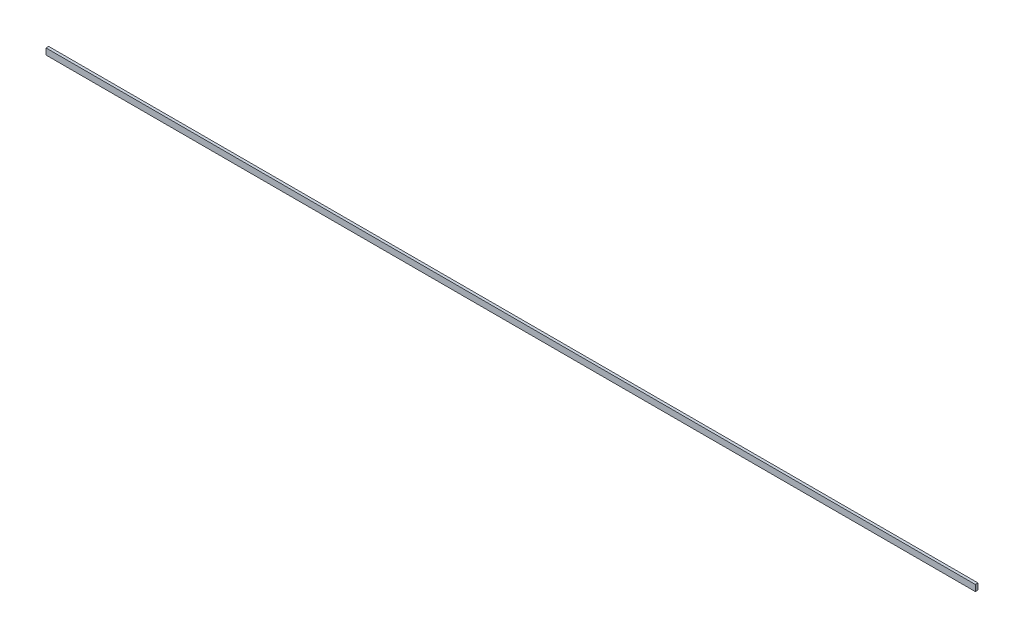
ISO-10303-21;
HEADER;
FILE_DESCRIPTION(('STEP AP214'),'2;1');
FILE_NAME('part.step','',(''),(''),'','','');
FILE_SCHEMA(('AUTOMOTIVE_DESIGN { 1 0 10303 214 1 1 1 1 }'));
ENDSEC;
DATA;
#1=APPLICATION_CONTEXT('core data for automotive mechanical design processes');
#2=APPLICATION_PROTOCOL_DEFINITION('international standard','automotive_design',2000,#1);
#3=PRODUCT_CONTEXT('',#1,'mechanical');
#4=PRODUCT('Part','Part','',(#3));
#5=PRODUCT_RELATED_PRODUCT_CATEGORY('part','',(#4));
#6=PRODUCT_DEFINITION_FORMATION('','',#4);
#7=PRODUCT_DEFINITION_CONTEXT('part definition',#1,'design');
#8=PRODUCT_DEFINITION('design','',#6,#7);
#9=PRODUCT_DEFINITION_SHAPE('','',#8);
#10=(LENGTH_UNIT() NAMED_UNIT(*) SI_UNIT(.MILLI.,.METRE.));
#11=(NAMED_UNIT(*) PLANE_ANGLE_UNIT() SI_UNIT($,.RADIAN.));
#12=(NAMED_UNIT(*) SI_UNIT($,.STERADIAN.) SOLID_ANGLE_UNIT());
#13=UNCERTAINTY_MEASURE_WITH_UNIT(LENGTH_MEASURE(1.E-05),#10,'distance_accuracy_value','');
#14=(GEOMETRIC_REPRESENTATION_CONTEXT(3) GLOBAL_UNCERTAINTY_ASSIGNED_CONTEXT((#13)) GLOBAL_UNIT_ASSIGNED_CONTEXT((#10,
#11,#12)) REPRESENTATION_CONTEXT('',''));
#15=CARTESIAN_POINT('',(0.,0.,0.));
#16=DIRECTION('',(0.,0.,1.));
#17=DIRECTION('',(1.,0.,0.));
#18=AXIS2_PLACEMENT_3D('',#15,#16,#17);
#19=CARTESIAN_POINT('',(0.,0.,1.5));
#20=DIRECTION('',(1.,0.,0.));
#21=DIRECTION('',(0.,0.,-1.));
#22=AXIS2_PLACEMENT_3D('',#19,#20,#21);
#23=PLANE('',#22);
#24=DIRECTION('',(0.,-1.,0.));
#25=VECTOR('',#24,1.);
#26=CARTESIAN_POINT('',(0.,0.,0.));
#27=LINE('',#26,#25);
#28=CARTESIAN_POINT('',(0.,0.,0.));
#29=VERTEX_POINT('',#28);
#30=CARTESIAN_POINT('',(0.,-3.5,0.));
#31=VERTEX_POINT('',#30);
#32=EDGE_CURVE('E99',#29,#31,#27,.T.);
#33=ORIENTED_EDGE('',*,*,#32,.T.);
#34=DIRECTION('',(0.,0.,-1.));
#35=VECTOR('',#34,1.);
#36=CARTESIAN_POINT('',(0.,-3.5,1.5));
#37=LINE('',#36,#35);
#38=CARTESIAN_POINT('',(0.,-3.5,1.5));
#39=VERTEX_POINT('',#38);
#40=EDGE_CURVE('E11',#39,#31,#37,.T.);
#41=ORIENTED_EDGE('',*,*,#40,.F.);
#42=DIRECTION('',(0.,-1.,0.));
#43=VECTOR('',#42,1.);
#44=CARTESIAN_POINT('',(0.,0.,1.5));
#45=LINE('',#44,#43);
#46=CARTESIAN_POINT('',(0.,0.,1.5));
#47=VERTEX_POINT('',#46);
#48=EDGE_CURVE('E87',#47,#39,#45,.T.);
#49=ORIENTED_EDGE('',*,*,#48,.F.);
#50=DIRECTION('',(0.,0.,-1.));
#51=VECTOR('',#50,1.);
#52=CARTESIAN_POINT('',(0.,0.,1.5));
#53=LINE('',#52,#51);
#54=EDGE_CURVE('E95',#47,#29,#53,.T.);
#55=ORIENTED_EDGE('',*,*,#54,.T.);
#56=EDGE_LOOP('',(#33,#41,#49,#55));
#57=FACE_BOUND('',#56,.T.);
#58=ADVANCED_FACE('F36',(#57),#23,.F.);
#59=CARTESIAN_POINT('',(0.,-3.5,1.5));
#60=DIRECTION('',(0.,1.,0.));
#61=DIRECTION('',(0.,0.,1.));
#62=AXIS2_PLACEMENT_3D('',#59,#60,#61);
#63=PLANE('',#62);
#64=DIRECTION('',(1.,0.,0.));
#65=VECTOR('',#64,1.);
#66=CARTESIAN_POINT('',(0.,-3.5,0.));
#67=LINE('',#66,#65);
#68=CARTESIAN_POINT('',(525.1,-3.5,0.));
#69=VERTEX_POINT('',#68);
#70=EDGE_CURVE('E91',#31,#69,#67,.T.);
#71=ORIENTED_EDGE('',*,*,#70,.T.);
#72=DIRECTION('',(0.,0.,-1.));
#73=VECTOR('',#72,1.);
#74=CARTESIAN_POINT('',(525.1,-3.5,1.5));
#75=LINE('',#74,#73);
#76=CARTESIAN_POINT('',(525.1,-3.5,1.5));
#77=VERTEX_POINT('',#76);
#78=EDGE_CURVE('E44',#77,#69,#75,.T.);
#79=ORIENTED_EDGE('',*,*,#78,.F.);
#80=DIRECTION('',(1.,0.,0.));
#81=VECTOR('',#80,1.);
#82=CARTESIAN_POINT('',(0.,-3.5,1.5));
#83=LINE('',#82,#81);
#84=EDGE_CURVE('E82',#39,#77,#83,.T.);
#85=ORIENTED_EDGE('',*,*,#84,.F.);
#86=ORIENTED_EDGE('',*,*,#40,.T.);
#87=EDGE_LOOP('',(#71,#79,#85,#86));
#88=FACE_BOUND('',#87,.T.);
#89=ADVANCED_FACE('F90',(#88),#63,.F.);
#90=CARTESIAN_POINT('',(525.1,0.,1.5));
#91=DIRECTION('',(-1.,0.,0.));
#92=DIRECTION('',(0.,0.,1.));
#93=AXIS2_PLACEMENT_3D('',#90,#91,#92);
#94=PLANE('',#93);
#95=DIRECTION('',(0.,1.,0.));
#96=VECTOR('',#95,1.);
#97=CARTESIAN_POINT('',(525.1,0.,0.));
#98=LINE('',#97,#96);
#99=CARTESIAN_POINT('',(525.1,0.,0.));
#100=VERTEX_POINT('',#99);
#101=EDGE_CURVE('E69',#69,#100,#98,.T.);
#102=ORIENTED_EDGE('',*,*,#101,.T.);
#103=DIRECTION('',(0.,0.,-1.));
#104=VECTOR('',#103,1.);
#105=CARTESIAN_POINT('',(525.1,0.,1.5));
#106=LINE('',#105,#104);
#107=CARTESIAN_POINT('',(525.1,0.,1.5));
#108=VERTEX_POINT('',#107);
#109=EDGE_CURVE('E92',#108,#100,#106,.T.);
#110=ORIENTED_EDGE('',*,*,#109,.F.);
#111=DIRECTION('',(0.,1.,0.));
#112=VECTOR('',#111,1.);
#113=CARTESIAN_POINT('',(525.1,0.,1.5));
#114=LINE('',#113,#112);
#115=EDGE_CURVE('E85',#77,#108,#114,.T.);
#116=ORIENTED_EDGE('',*,*,#115,.F.);
#117=ORIENTED_EDGE('',*,*,#78,.T.);
#118=EDGE_LOOP('',(#102,#110,#116,#117));
#119=FACE_BOUND('',#118,.T.);
#120=ADVANCED_FACE('F93',(#119),#94,.F.);
#121=CARTESIAN_POINT('',(0.,0.,1.5));
#122=DIRECTION('',(0.,-1.,0.));
#123=DIRECTION('',(0.,0.,-1.));
#124=AXIS2_PLACEMENT_3D('',#121,#122,#123);
#125=PLANE('',#124);
#126=DIRECTION('',(-1.,0.,0.));
#127=VECTOR('',#126,1.);
#128=CARTESIAN_POINT('',(0.,0.,0.));
#129=LINE('',#128,#127);
#130=EDGE_CURVE('E75',#100,#29,#129,.T.);
#131=ORIENTED_EDGE('',*,*,#130,.T.);
#132=ORIENTED_EDGE('',*,*,#54,.F.);
#133=DIRECTION('',(-1.,0.,0.));
#134=VECTOR('',#133,1.);
#135=CARTESIAN_POINT('',(0.,0.,1.5));
#136=LINE('',#135,#134);
#137=EDGE_CURVE('E52',#108,#47,#136,.T.);
#138=ORIENTED_EDGE('',*,*,#137,.F.);
#139=ORIENTED_EDGE('',*,*,#109,.T.);
#140=EDGE_LOOP('',(#131,#132,#138,#139));
#141=FACE_BOUND('',#140,.T.);
#142=ADVANCED_FACE('F106',(#141),#125,.F.);
#143=CARTESIAN_POINT('',(0.,0.,1.5));
#144=DIRECTION('',(0.,0.,1.));
#145=DIRECTION('',(1.,0.,0.));
#146=AXIS2_PLACEMENT_3D('',#143,#144,#145);
#147=PLANE('',#146);
#148=ORIENTED_EDGE('',*,*,#48,.T.);
#149=ORIENTED_EDGE('',*,*,#84,.T.);
#150=ORIENTED_EDGE('',*,*,#115,.T.);
#151=ORIENTED_EDGE('',*,*,#137,.T.);
#152=EDGE_LOOP('',(#148,#149,#150,#151));
#153=FACE_BOUND('',#152,.T.);
#154=ADVANCED_FACE('F83',(#153),#147,.T.);
#155=CARTESIAN_POINT('',(0.,0.,0.));
#156=DIRECTION('',(0.,0.,1.));
#157=DIRECTION('',(1.,0.,0.));
#158=AXIS2_PLACEMENT_3D('',#155,#156,#157);
#159=PLANE('',#158);
#160=ORIENTED_EDGE('',*,*,#32,.F.);
#161=ORIENTED_EDGE('',*,*,#130,.F.);
#162=ORIENTED_EDGE('',*,*,#101,.F.);
#163=ORIENTED_EDGE('',*,*,#70,.F.);
#164=EDGE_LOOP('',(#160,#161,#162,#163));
#165=FACE_BOUND('',#164,.T.);
#166=ADVANCED_FACE('F109',(#165),#159,.F.);
#167=CLOSED_SHELL('',(#58,#89,#120,#142,#154,#166));
#168=MANIFOLD_SOLID_BREP('B2',#167);
#169=ADVANCED_BREP_SHAPE_REPRESENTATION('',(#18,#168),#14);
#170=SHAPE_DEFINITION_REPRESENTATION(#9,#169);
ENDSEC;
END-ISO-10303-21;
